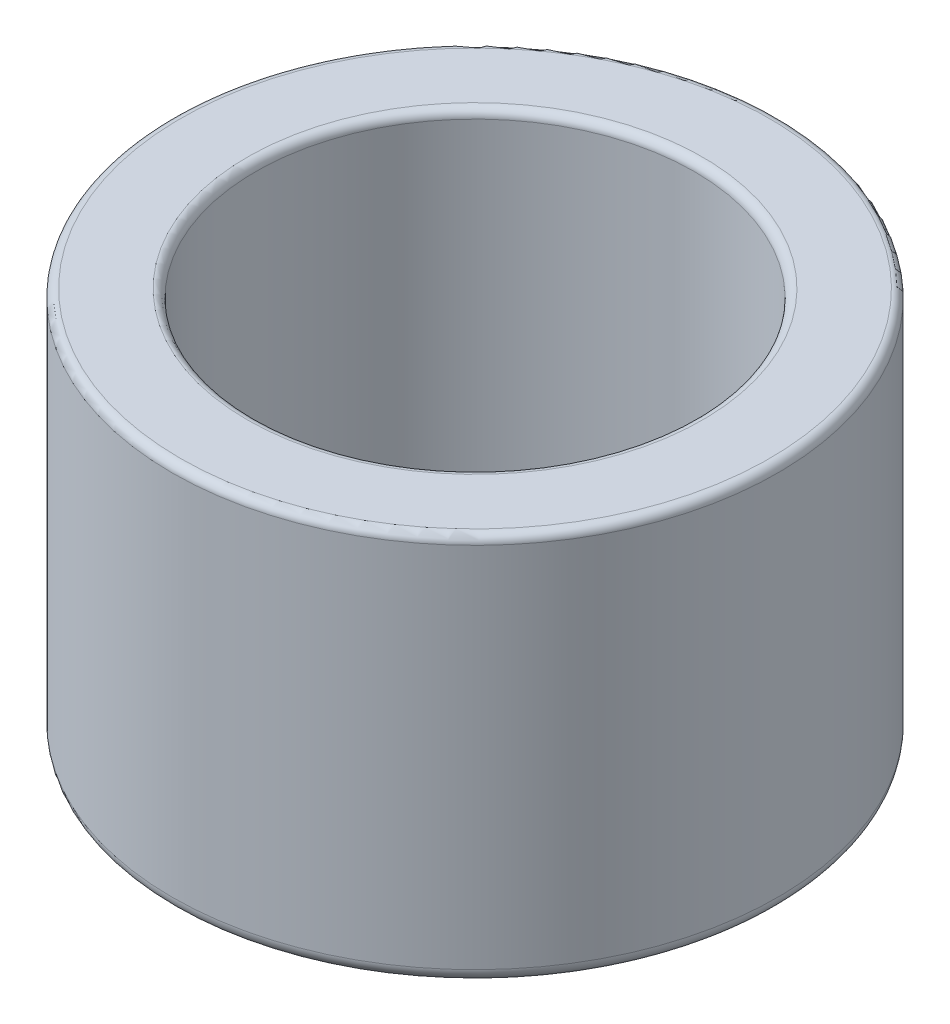
ISO-10303-21;
HEADER;
FILE_DESCRIPTION(('STEP AP214'),'2;1');
FILE_NAME('part.step','',(''),(''),'','','');
FILE_SCHEMA(('AUTOMOTIVE_DESIGN { 1 0 10303 214 1 1 1 1 }'));
ENDSEC;
DATA;
#1=APPLICATION_CONTEXT('core data for automotive mechanical design processes');
#2=APPLICATION_PROTOCOL_DEFINITION('international standard','automotive_design',2000,#1);
#3=PRODUCT_CONTEXT('',#1,'mechanical');
#4=PRODUCT('Part','Part','',(#3));
#5=PRODUCT_RELATED_PRODUCT_CATEGORY('part','',(#4));
#6=PRODUCT_DEFINITION_FORMATION('','',#4);
#7=PRODUCT_DEFINITION_CONTEXT('part definition',#1,'design');
#8=PRODUCT_DEFINITION('design','',#6,#7);
#9=PRODUCT_DEFINITION_SHAPE('','',#8);
#10=(LENGTH_UNIT() NAMED_UNIT(*) SI_UNIT(.MILLI.,.METRE.));
#11=(NAMED_UNIT(*) PLANE_ANGLE_UNIT() SI_UNIT($,.RADIAN.));
#12=(NAMED_UNIT(*) SI_UNIT($,.STERADIAN.) SOLID_ANGLE_UNIT());
#13=UNCERTAINTY_MEASURE_WITH_UNIT(LENGTH_MEASURE(1.E-05),#10,'distance_accuracy_value','');
#14=(GEOMETRIC_REPRESENTATION_CONTEXT(3) GLOBAL_UNCERTAINTY_ASSIGNED_CONTEXT((#13)) GLOBAL_UNIT_ASSIGNED_CONTEXT((#10,
#11,#12)) REPRESENTATION_CONTEXT('',''));
#15=CARTESIAN_POINT('',(0.,0.,0.));
#16=DIRECTION('',(0.,0.,1.));
#17=DIRECTION('',(1.,0.,0.));
#18=AXIS2_PLACEMENT_3D('',#15,#16,#17);
#19=CARTESIAN_POINT('',(0.,14.,0.));
#20=DIRECTION('',(0.,1.,0.));
#21=DIRECTION('',(0.,0.,1.));
#22=AXIS2_PLACEMENT_3D('',#19,#20,#21);
#23=PLANE('',#22);
#24=CARTESIAN_POINT('',(0.,14.,0.));
#25=DIRECTION('',(0.,1.,0.));
#26=DIRECTION('',(0.,0.,1.));
#27=AXIS2_PLACEMENT_3D('',#24,#25,#26);
#28=CIRCLE('',#27,8.17817);
#29=CARTESIAN_POINT('',(0.,14.,8.17817));
#30=VERTEX_POINT('',#29);
#31=EDGE_CURVE('E52',#30,#30,#28,.F.);
#32=ORIENTED_EDGE('',*,*,#31,.T.);
#33=EDGE_LOOP('',(#32));
#34=FACE_BOUND('',#33,.T.);
#35=CARTESIAN_POINT('',(0.,14.,0.));
#36=DIRECTION('',(0.,1.,0.));
#37=DIRECTION('',(0.,0.,1.));
#38=AXIS2_PLACEMENT_3D('',#35,#36,#37);
#39=CIRCLE('',#38,10.57817);
#40=CARTESIAN_POINT('',(0.,14.,10.57817));
#41=VERTEX_POINT('',#40);
#42=EDGE_CURVE('E61',#41,#41,#39,.T.);
#43=ORIENTED_EDGE('',*,*,#42,.T.);
#44=EDGE_LOOP('',(#43));
#45=FACE_BOUND('',#44,.T.);
#46=ADVANCED_FACE('F32',(#34,#45),#23,.T.);
#47=CARTESIAN_POINT('',(0.,0.,0.));
#48=DIRECTION('',(0.,1.,0.));
#49=DIRECTION('',(0.,0.,1.));
#50=AXIS2_PLACEMENT_3D('',#47,#48,#49);
#51=PLANE('',#50);
#52=CARTESIAN_POINT('',(0.,0.,0.));
#53=DIRECTION('',(0.,1.,0.));
#54=DIRECTION('',(0.,0.,1.));
#55=AXIS2_PLACEMENT_3D('',#52,#53,#54);
#56=CIRCLE('',#55,8.37817);
#57=CARTESIAN_POINT('',(0.,0.,8.37817));
#58=VERTEX_POINT('',#57);
#59=EDGE_CURVE('E39',#58,#58,#56,.T.);
#60=ORIENTED_EDGE('',*,*,#59,.T.);
#61=EDGE_LOOP('',(#60));
#62=FACE_BOUND('',#61,.T.);
#63=CARTESIAN_POINT('',(0.,0.,0.));
#64=DIRECTION('',(0.,1.,0.));
#65=DIRECTION('',(0.,0.,1.));
#66=AXIS2_PLACEMENT_3D('',#63,#64,#65);
#67=CIRCLE('',#66,10.37817);
#68=CARTESIAN_POINT('',(0.,0.,10.37817));
#69=VERTEX_POINT('',#68);
#70=EDGE_CURVE('E43',#69,#69,#67,.F.);
#71=ORIENTED_EDGE('',*,*,#70,.T.);
#72=EDGE_LOOP('',(#71));
#73=FACE_BOUND('',#72,.T.);
#74=ADVANCED_FACE('F84',(#62,#73),#51,.F.);
#75=CARTESIAN_POINT('',(0.,14.,0.));
#76=DIRECTION('',(0.,-1.,0.));
#77=DIRECTION('',(0.,0.,-1.));
#78=AXIS2_PLACEMENT_3D('',#75,#76,#77);
#79=CYLINDRICAL_SURFACE('',#78,10.87817);
#80=CARTESIAN_POINT('',(0.,0.5,0.));
#81=DIRECTION('',(0.,1.,0.));
#82=DIRECTION('',(0.,0.,1.));
#83=AXIS2_PLACEMENT_3D('',#80,#81,#82);
#84=CIRCLE('',#83,10.87817);
#85=CARTESIAN_POINT('',(0.,0.5,10.87817));
#86=VERTEX_POINT('',#85);
#87=EDGE_CURVE('E47',#86,#86,#84,.T.);
#88=ORIENTED_EDGE('',*,*,#87,.T.);
#89=EDGE_LOOP('',(#88));
#90=FACE_BOUND('',#89,.T.);
#91=CARTESIAN_POINT('',(0.,13.7,0.));
#92=DIRECTION('',(0.,1.,0.));
#93=DIRECTION('',(0.,0.,1.));
#94=AXIS2_PLACEMENT_3D('',#91,#92,#93);
#95=CIRCLE('',#94,10.87817);
#96=CARTESIAN_POINT('',(0.,13.7,10.87817));
#97=VERTEX_POINT('',#96);
#98=EDGE_CURVE('E58',#97,#97,#95,.F.);
#99=ORIENTED_EDGE('',*,*,#98,.T.);
#100=EDGE_LOOP('',(#99));
#101=FACE_BOUND('',#100,.T.);
#102=ADVANCED_FACE('F79',(#90,#101),#79,.T.);
#103=CARTESIAN_POINT('',(0.,14.,0.));
#104=DIRECTION('',(0.,-1.,0.));
#105=DIRECTION('',(0.,0.,-1.));
#106=AXIS2_PLACEMENT_3D('',#103,#104,#105);
#107=CYLINDRICAL_SURFACE('',#106,7.87817);
#108=CARTESIAN_POINT('',(0.,0.5,0.));
#109=DIRECTION('',(0.,1.,0.));
#110=DIRECTION('',(0.,0.,1.));
#111=AXIS2_PLACEMENT_3D('',#108,#109,#110);
#112=CIRCLE('',#111,7.87817);
#113=CARTESIAN_POINT('',(0.,0.5,7.87817));
#114=VERTEX_POINT('',#113);
#115=EDGE_CURVE('E10',#114,#114,#112,.F.);
#116=ORIENTED_EDGE('',*,*,#115,.T.);
#117=EDGE_LOOP('',(#116));
#118=FACE_BOUND('',#117,.T.);
#119=CARTESIAN_POINT('',(0.,13.7,0.));
#120=DIRECTION('',(0.,1.,0.));
#121=DIRECTION('',(0.,0.,1.));
#122=AXIS2_PLACEMENT_3D('',#119,#120,#121);
#123=CIRCLE('',#122,7.87817);
#124=CARTESIAN_POINT('',(0.,13.7,7.87817));
#125=VERTEX_POINT('',#124);
#126=EDGE_CURVE('E55',#125,#125,#123,.T.);
#127=ORIENTED_EDGE('',*,*,#126,.T.);
#128=EDGE_LOOP('',(#127));
#129=FACE_BOUND('',#128,.T.);
#130=ADVANCED_FACE('F69',(#118,#129),#107,.F.);
#131=CARTESIAN_POINT('',(0.,13.7,0.));
#132=DIRECTION('',(0.,1.,0.));
#133=DIRECTION('',(0.,0.,1.));
#134=AXIS2_PLACEMENT_3D('',#131,#132,#133);
#135=TOROIDAL_SURFACE('',#134,10.57817,0.3);
#136=ORIENTED_EDGE('',*,*,#98,.F.);
#137=EDGE_LOOP('',(#136));
#138=FACE_BOUND('',#137,.T.);
#139=ORIENTED_EDGE('',*,*,#42,.F.);
#140=EDGE_LOOP('',(#139));
#141=FACE_BOUND('',#140,.T.);
#142=ADVANCED_FACE('F66',(#138,#141),#135,.T.);
#143=CARTESIAN_POINT('',(0.,13.7,0.));
#144=DIRECTION('',(0.,1.,0.));
#145=DIRECTION('',(0.,0.,1.));
#146=AXIS2_PLACEMENT_3D('',#143,#144,#145);
#147=TOROIDAL_SURFACE('',#146,8.17817,0.3);
#148=ORIENTED_EDGE('',*,*,#31,.F.);
#149=EDGE_LOOP('',(#148));
#150=FACE_BOUND('',#149,.T.);
#151=ORIENTED_EDGE('',*,*,#126,.F.);
#152=EDGE_LOOP('',(#151));
#153=FACE_BOUND('',#152,.T.);
#154=ADVANCED_FACE('F68',(#150,#153),#147,.T.);
#155=CARTESIAN_POINT('',(0.,0.5,0.));
#156=DIRECTION('',(0.,1.,0.));
#157=DIRECTION('',(0.,0.,1.));
#158=AXIS2_PLACEMENT_3D('',#155,#156,#157);
#159=TOROIDAL_SURFACE('',#158,10.37817,0.5);
#160=ORIENTED_EDGE('',*,*,#70,.F.);
#161=EDGE_LOOP('',(#160));
#162=FACE_BOUND('',#161,.T.);
#163=ORIENTED_EDGE('',*,*,#87,.F.);
#164=EDGE_LOOP('',(#163));
#165=FACE_BOUND('',#164,.T.);
#166=ADVANCED_FACE('F76',(#162,#165),#159,.T.);
#167=CARTESIAN_POINT('',(0.,0.5,0.));
#168=DIRECTION('',(0.,1.,0.));
#169=DIRECTION('',(0.,0.,1.));
#170=AXIS2_PLACEMENT_3D('',#167,#168,#169);
#171=TOROIDAL_SURFACE('',#170,8.37817,0.5);
#172=ORIENTED_EDGE('',*,*,#115,.F.);
#173=EDGE_LOOP('',(#172));
#174=FACE_BOUND('',#173,.T.);
#175=ORIENTED_EDGE('',*,*,#59,.F.);
#176=EDGE_LOOP('',(#175));
#177=FACE_BOUND('',#176,.T.);
#178=ADVANCED_FACE('F34',(#174,#177),#171,.T.);
#179=CLOSED_SHELL('',(#46,#74,#102,#130,#142,#154,#166,#178));
#180=MANIFOLD_SOLID_BREP('B2',#179);
#181=ADVANCED_BREP_SHAPE_REPRESENTATION('',(#18,#180),#14);
#182=SHAPE_DEFINITION_REPRESENTATION(#9,#181);
ENDSEC;
END-ISO-10303-21;
